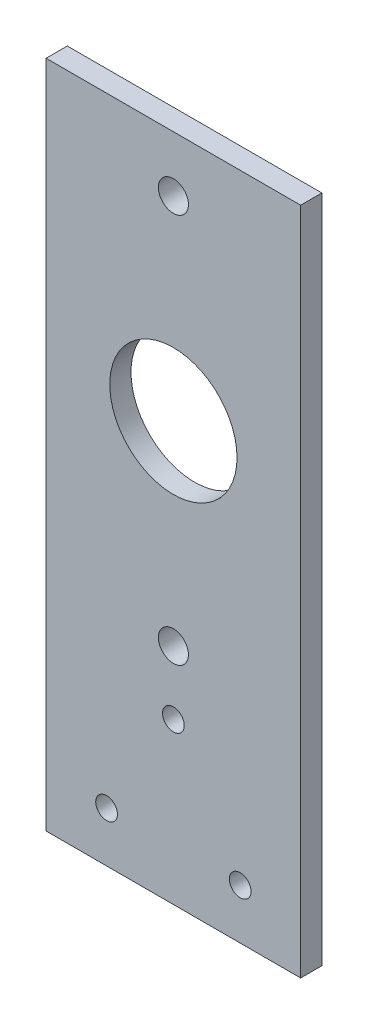
ISO-10303-21;
HEADER;
FILE_DESCRIPTION(('STEP AP214'),'2;1');
FILE_NAME('part.step','',(''),(''),'','','');
FILE_SCHEMA(('AUTOMOTIVE_DESIGN { 1 0 10303 214 1 1 1 1 }'));
ENDSEC;
DATA;
#1=APPLICATION_CONTEXT('core data for automotive mechanical design processes');
#2=APPLICATION_PROTOCOL_DEFINITION('international standard','automotive_design',2000,#1);
#3=PRODUCT_CONTEXT('',#1,'mechanical');
#4=PRODUCT('Part','Part','',(#3));
#5=PRODUCT_RELATED_PRODUCT_CATEGORY('part','',(#4));
#6=PRODUCT_DEFINITION_FORMATION('','',#4);
#7=PRODUCT_DEFINITION_CONTEXT('part definition',#1,'design');
#8=PRODUCT_DEFINITION('design','',#6,#7);
#9=PRODUCT_DEFINITION_SHAPE('','',#8);
#10=(LENGTH_UNIT() NAMED_UNIT(*) SI_UNIT(.MILLI.,.METRE.));
#11=(NAMED_UNIT(*) PLANE_ANGLE_UNIT() SI_UNIT($,.RADIAN.));
#12=(NAMED_UNIT(*) SI_UNIT($,.STERADIAN.) SOLID_ANGLE_UNIT());
#13=UNCERTAINTY_MEASURE_WITH_UNIT(LENGTH_MEASURE(1.E-05),#10,'distance_accuracy_value','');
#14=(GEOMETRIC_REPRESENTATION_CONTEXT(3) GLOBAL_UNCERTAINTY_ASSIGNED_CONTEXT((#13)) GLOBAL_UNIT_ASSIGNED_CONTEXT((#10,
#11,#12)) REPRESENTATION_CONTEXT('',''));
#15=CARTESIAN_POINT('',(0.,0.,0.));
#16=DIRECTION('',(0.,0.,1.));
#17=DIRECTION('',(1.,0.,0.));
#18=AXIS2_PLACEMENT_3D('',#15,#16,#17);
#19=CARTESIAN_POINT('',(0.,0.,6.35));
#20=DIRECTION('',(0.,0.,1.));
#21=DIRECTION('',(1.,0.,0.));
#22=AXIS2_PLACEMENT_3D('',#19,#20,#21);
#23=PLANE('',#22);
#24=CARTESIAN_POINT('',(20.,-110.35,6.35));
#25=DIRECTION('',(0.,0.,1.));
#26=DIRECTION('',(1.,0.,0.));
#27=AXIS2_PLACEMENT_3D('',#24,#25,#26);
#28=CIRCLE('',#27,3.25);
#29=CARTESIAN_POINT('',(23.25,-110.35,6.35));
#30=VERTEX_POINT('',#29);
#31=EDGE_CURVE('E132',#30,#30,#28,.T.);
#32=ORIENTED_EDGE('',*,*,#31,.F.);
#33=EDGE_LOOP('',(#32));
#34=FACE_BOUND('',#33,.T.);
#35=CARTESIAN_POINT('',(0.,-58.34,6.35));
#36=DIRECTION('',(0.,0.,1.));
#37=DIRECTION('',(1.,0.,0.));
#38=AXIS2_PLACEMENT_3D('',#35,#36,#37);
#39=CIRCLE('',#38,4.50000000000001);
#40=CARTESIAN_POINT('',(4.50000000000002,-58.34,6.35));
#41=VERTEX_POINT('',#40);
#42=EDGE_CURVE('E120',#41,#41,#39,.T.);
#43=ORIENTED_EDGE('',*,*,#42,.F.);
#44=EDGE_LOOP('',(#43));
#45=FACE_BOUND('',#44,.T.);
#46=CARTESIAN_POINT('',(0.,0.,6.35));
#47=DIRECTION('',(0.,0.,1.));
#48=DIRECTION('',(1.,0.,0.));
#49=AXIS2_PLACEMENT_3D('',#46,#47,#48);
#50=CIRCLE('',#49,19.05);
#51=CARTESIAN_POINT('',(19.05,0.,6.35));
#52=VERTEX_POINT('',#51);
#53=EDGE_CURVE('E99',#52,#52,#50,.T.);
#54=ORIENTED_EDGE('',*,*,#53,.F.);
#55=EDGE_LOOP('',(#54));
#56=FACE_BOUND('',#55,.T.);
#57=DIRECTION('',(0.,-1.,0.));
#58=VECTOR('',#57,1.);
#59=CARTESIAN_POINT('',(-38.1,75.,6.35));
#60=LINE('',#59,#58);
#61=CARTESIAN_POINT('',(-38.1,75.,6.35));
#62=VERTEX_POINT('',#61);
#63=CARTESIAN_POINT('',(-38.1,-125.35,6.35));
#64=VERTEX_POINT('',#63);
#65=EDGE_CURVE('E84',#62,#64,#60,.T.);
#66=ORIENTED_EDGE('',*,*,#65,.T.);
#67=DIRECTION('',(1.,0.,0.));
#68=VECTOR('',#67,1.);
#69=CARTESIAN_POINT('',(-38.1,-125.35,6.35));
#70=LINE('',#69,#68);
#71=CARTESIAN_POINT('',(38.1,-125.35,6.35));
#72=VERTEX_POINT('',#71);
#73=EDGE_CURVE('E79',#64,#72,#70,.T.);
#74=ORIENTED_EDGE('',*,*,#73,.T.);
#75=DIRECTION('',(0.,1.,0.));
#76=VECTOR('',#75,1.);
#77=CARTESIAN_POINT('',(38.1,75.,6.35));
#78=LINE('',#77,#76);
#79=CARTESIAN_POINT('',(38.1,75.,6.35));
#80=VERTEX_POINT('',#79);
#81=EDGE_CURVE('E82',#72,#80,#78,.T.);
#82=ORIENTED_EDGE('',*,*,#81,.T.);
#83=DIRECTION('',(-1.,0.,0.));
#84=VECTOR('',#83,1.);
#85=CARTESIAN_POINT('',(-38.1,75.,6.35));
#86=LINE('',#85,#84);
#87=EDGE_CURVE('E49',#80,#62,#86,.T.);
#88=ORIENTED_EDGE('',*,*,#87,.T.);
#89=EDGE_LOOP('',(#66,#74,#82,#88));
#90=FACE_BOUND('',#89,.T.);
#91=CARTESIAN_POINT('',(0.,58.34,6.35));
#92=DIRECTION('',(0.,0.,1.));
#93=DIRECTION('',(1.,0.,0.));
#94=AXIS2_PLACEMENT_3D('',#91,#92,#93);
#95=CIRCLE('',#94,4.5);
#96=CARTESIAN_POINT('',(4.49999999999999,58.34,6.35));
#97=VERTEX_POINT('',#96);
#98=EDGE_CURVE('E114',#97,#97,#95,.T.);
#99=ORIENTED_EDGE('',*,*,#98,.F.);
#100=EDGE_LOOP('',(#99));
#101=FACE_BOUND('',#100,.T.);
#102=CARTESIAN_POINT('',(-20.,-110.35,6.35));
#103=DIRECTION('',(0.,0.,1.));
#104=DIRECTION('',(1.,0.,0.));
#105=AXIS2_PLACEMENT_3D('',#102,#103,#104);
#106=CIRCLE('',#105,3.25);
#107=CARTESIAN_POINT('',(-16.75,-110.35,6.35));
#108=VERTEX_POINT('',#107);
#109=EDGE_CURVE('E126',#108,#108,#106,.T.);
#110=ORIENTED_EDGE('',*,*,#109,.F.);
#111=EDGE_LOOP('',(#110));
#112=FACE_BOUND('',#111,.T.);
#113=CARTESIAN_POINT('',(0.,-77.35,6.35));
#114=DIRECTION('',(0.,0.,1.));
#115=DIRECTION('',(1.,0.,0.));
#116=AXIS2_PLACEMENT_3D('',#113,#114,#115);
#117=CIRCLE('',#116,3.25);
#118=CARTESIAN_POINT('',(3.25000000000001,-77.35,6.35));
#119=VERTEX_POINT('',#118);
#120=EDGE_CURVE('E138',#119,#119,#117,.T.);
#121=ORIENTED_EDGE('',*,*,#120,.F.);
#122=EDGE_LOOP('',(#121));
#123=FACE_BOUND('',#122,.T.);
#124=ADVANCED_FACE('F32',(#34,#45,#56,#90,#101,#112,#123),#23,.T.);
#125=CARTESIAN_POINT('',(0.,0.,0.));
#126=DIRECTION('',(0.,0.,1.));
#127=DIRECTION('',(1.,0.,0.));
#128=AXIS2_PLACEMENT_3D('',#125,#126,#127);
#129=PLANE('',#128);
#130=CARTESIAN_POINT('',(20.,-110.35,0.));
#131=DIRECTION('',(0.,0.,1.));
#132=DIRECTION('',(1.,0.,0.));
#133=AXIS2_PLACEMENT_3D('',#130,#131,#132);
#134=CIRCLE('',#133,3.25);
#135=CARTESIAN_POINT('',(23.25,-110.35,0.));
#136=VERTEX_POINT('',#135);
#137=EDGE_CURVE('E135',#136,#136,#134,.T.);
#138=ORIENTED_EDGE('',*,*,#137,.T.);
#139=EDGE_LOOP('',(#138));
#140=FACE_BOUND('',#139,.T.);
#141=CARTESIAN_POINT('',(0.,-58.34,0.));
#142=DIRECTION('',(0.,0.,1.));
#143=DIRECTION('',(1.,0.,0.));
#144=AXIS2_PLACEMENT_3D('',#141,#142,#143);
#145=CIRCLE('',#144,4.50000000000001);
#146=CARTESIAN_POINT('',(4.50000000000002,-58.34,0.));
#147=VERTEX_POINT('',#146);
#148=EDGE_CURVE('E123',#147,#147,#145,.T.);
#149=ORIENTED_EDGE('',*,*,#148,.T.);
#150=EDGE_LOOP('',(#149));
#151=FACE_BOUND('',#150,.T.);
#152=CARTESIAN_POINT('',(0.,0.,0.));
#153=DIRECTION('',(0.,0.,1.));
#154=DIRECTION('',(1.,0.,0.));
#155=AXIS2_PLACEMENT_3D('',#152,#153,#154);
#156=CIRCLE('',#155,19.05);
#157=CARTESIAN_POINT('',(19.05,0.,0.));
#158=VERTEX_POINT('',#157);
#159=EDGE_CURVE('E111',#158,#158,#156,.T.);
#160=ORIENTED_EDGE('',*,*,#159,.T.);
#161=EDGE_LOOP('',(#160));
#162=FACE_BOUND('',#161,.T.);
#163=DIRECTION('',(0.,-1.,0.));
#164=VECTOR('',#163,1.);
#165=CARTESIAN_POINT('',(-38.1,75.,0.));
#166=LINE('',#165,#164);
#167=CARTESIAN_POINT('',(-38.1,75.,0.));
#168=VERTEX_POINT('',#167);
#169=CARTESIAN_POINT('',(-38.1,-125.35,0.));
#170=VERTEX_POINT('',#169);
#171=EDGE_CURVE('E96',#168,#170,#166,.T.);
#172=ORIENTED_EDGE('',*,*,#171,.F.);
#173=DIRECTION('',(-1.,0.,0.));
#174=VECTOR('',#173,1.);
#175=CARTESIAN_POINT('',(-38.1,75.,0.));
#176=LINE('',#175,#174);
#177=CARTESIAN_POINT('',(38.1,75.,0.));
#178=VERTEX_POINT('',#177);
#179=EDGE_CURVE('E72',#178,#168,#176,.T.);
#180=ORIENTED_EDGE('',*,*,#179,.F.);
#181=DIRECTION('',(0.,1.,0.));
#182=VECTOR('',#181,1.);
#183=CARTESIAN_POINT('',(38.1,75.,0.));
#184=LINE('',#183,#182);
#185=CARTESIAN_POINT('',(38.1,-125.35,0.));
#186=VERTEX_POINT('',#185);
#187=EDGE_CURVE('E66',#186,#178,#184,.T.);
#188=ORIENTED_EDGE('',*,*,#187,.F.);
#189=DIRECTION('',(1.,0.,0.));
#190=VECTOR('',#189,1.);
#191=CARTESIAN_POINT('',(-38.1,-125.35,0.));
#192=LINE('',#191,#190);
#193=EDGE_CURVE('E88',#170,#186,#192,.T.);
#194=ORIENTED_EDGE('',*,*,#193,.F.);
#195=EDGE_LOOP('',(#172,#180,#188,#194));
#196=FACE_BOUND('',#195,.T.);
#197=CARTESIAN_POINT('',(0.,58.34,0.));
#198=DIRECTION('',(0.,0.,1.));
#199=DIRECTION('',(1.,0.,0.));
#200=AXIS2_PLACEMENT_3D('',#197,#198,#199);
#201=CIRCLE('',#200,4.5);
#202=CARTESIAN_POINT('',(4.49999999999999,58.34,0.));
#203=VERTEX_POINT('',#202);
#204=EDGE_CURVE('E117',#203,#203,#201,.T.);
#205=ORIENTED_EDGE('',*,*,#204,.T.);
#206=EDGE_LOOP('',(#205));
#207=FACE_BOUND('',#206,.T.);
#208=CARTESIAN_POINT('',(-20.,-110.35,0.));
#209=DIRECTION('',(0.,0.,1.));
#210=DIRECTION('',(1.,0.,0.));
#211=AXIS2_PLACEMENT_3D('',#208,#209,#210);
#212=CIRCLE('',#211,3.25);
#213=CARTESIAN_POINT('',(-16.75,-110.35,0.));
#214=VERTEX_POINT('',#213);
#215=EDGE_CURVE('E129',#214,#214,#212,.T.);
#216=ORIENTED_EDGE('',*,*,#215,.T.);
#217=EDGE_LOOP('',(#216));
#218=FACE_BOUND('',#217,.T.);
#219=CARTESIAN_POINT('',(0.,-77.35,0.));
#220=DIRECTION('',(0.,0.,1.));
#221=DIRECTION('',(1.,0.,0.));
#222=AXIS2_PLACEMENT_3D('',#219,#220,#221);
#223=CIRCLE('',#222,3.25);
#224=CARTESIAN_POINT('',(3.25000000000001,-77.35,0.));
#225=VERTEX_POINT('',#224);
#226=EDGE_CURVE('E141',#225,#225,#223,.T.);
#227=ORIENTED_EDGE('',*,*,#226,.T.);
#228=EDGE_LOOP('',(#227));
#229=FACE_BOUND('',#228,.T.);
#230=ADVANCED_FACE('F107',(#140,#151,#162,#196,#207,#218,#229),#129,.F.);
#231=CARTESIAN_POINT('',(-38.1,75.,6.35));
#232=DIRECTION('',(1.,0.,0.));
#233=DIRECTION('',(0.,1.,0.));
#234=AXIS2_PLACEMENT_3D('',#231,#232,#233);
#235=PLANE('',#234);
#236=ORIENTED_EDGE('',*,*,#171,.T.);
#237=DIRECTION('',(0.,0.,-1.));
#238=VECTOR('',#237,1.);
#239=CARTESIAN_POINT('',(-38.1,-125.35,6.35));
#240=LINE('',#239,#238);
#241=EDGE_CURVE('E11',#64,#170,#240,.T.);
#242=ORIENTED_EDGE('',*,*,#241,.F.);
#243=ORIENTED_EDGE('',*,*,#65,.F.);
#244=DIRECTION('',(0.,0.,-1.));
#245=VECTOR('',#244,1.);
#246=CARTESIAN_POINT('',(-38.1,75.,6.35));
#247=LINE('',#246,#245);
#248=EDGE_CURVE('E92',#62,#168,#247,.T.);
#249=ORIENTED_EDGE('',*,*,#248,.T.);
#250=EDGE_LOOP('',(#236,#242,#243,#249));
#251=FACE_BOUND('',#250,.T.);
#252=ADVANCED_FACE('F34',(#251),#235,.F.);
#253=CARTESIAN_POINT('',(-38.1,-125.35,6.35));
#254=DIRECTION('',(0.,1.,0.));
#255=DIRECTION('',(0.,0.,1.));
#256=AXIS2_PLACEMENT_3D('',#253,#254,#255);
#257=PLANE('',#256);
#258=ORIENTED_EDGE('',*,*,#193,.T.);
#259=DIRECTION('',(0.,0.,-1.));
#260=VECTOR('',#259,1.);
#261=CARTESIAN_POINT('',(38.1,-125.35,6.35));
#262=LINE('',#261,#260);
#263=EDGE_CURVE('E41',#72,#186,#262,.T.);
#264=ORIENTED_EDGE('',*,*,#263,.F.);
#265=ORIENTED_EDGE('',*,*,#73,.F.);
#266=ORIENTED_EDGE('',*,*,#241,.T.);
#267=EDGE_LOOP('',(#258,#264,#265,#266));
#268=FACE_BOUND('',#267,.T.);
#269=ADVANCED_FACE('F87',(#268),#257,.F.);
#270=CARTESIAN_POINT('',(38.1,75.,6.35));
#271=DIRECTION('',(-1.,0.,0.));
#272=DIRECTION('',(0.,-1.,0.));
#273=AXIS2_PLACEMENT_3D('',#270,#271,#272);
#274=PLANE('',#273);
#275=ORIENTED_EDGE('',*,*,#187,.T.);
#276=DIRECTION('',(0.,0.,-1.));
#277=VECTOR('',#276,1.);
#278=CARTESIAN_POINT('',(38.1,75.,6.35));
#279=LINE('',#278,#277);
#280=EDGE_CURVE('E89',#80,#178,#279,.T.);
#281=ORIENTED_EDGE('',*,*,#280,.F.);
#282=ORIENTED_EDGE('',*,*,#81,.F.);
#283=ORIENTED_EDGE('',*,*,#263,.T.);
#284=EDGE_LOOP('',(#275,#281,#282,#283));
#285=FACE_BOUND('',#284,.T.);
#286=ADVANCED_FACE('F90',(#285),#274,.F.);
#287=CARTESIAN_POINT('',(-38.1,75.,6.35));
#288=DIRECTION('',(0.,-1.,0.));
#289=DIRECTION('',(1.,0.,0.));
#290=AXIS2_PLACEMENT_3D('',#287,#288,#289);
#291=PLANE('',#290);
#292=ORIENTED_EDGE('',*,*,#179,.T.);
#293=ORIENTED_EDGE('',*,*,#248,.F.);
#294=ORIENTED_EDGE('',*,*,#87,.F.);
#295=ORIENTED_EDGE('',*,*,#280,.T.);
#296=EDGE_LOOP('',(#292,#293,#294,#295));
#297=FACE_BOUND('',#296,.T.);
#298=ADVANCED_FACE('F104',(#297),#291,.F.);
#299=CARTESIAN_POINT('',(0.,0.,6.35));
#300=DIRECTION('',(0.,0.,-1.));
#301=DIRECTION('',(-1.,0.,0.));
#302=AXIS2_PLACEMENT_3D('',#299,#300,#301);
#303=CYLINDRICAL_SURFACE('',#302,19.05);
#304=ORIENTED_EDGE('',*,*,#53,.T.);
#305=EDGE_LOOP('',(#304));
#306=FACE_BOUND('',#305,.T.);
#307=ORIENTED_EDGE('',*,*,#159,.F.);
#308=EDGE_LOOP('',(#307));
#309=FACE_BOUND('',#308,.T.);
#310=ADVANCED_FACE('F161',(#306,#309),#303,.F.);
#311=CARTESIAN_POINT('',(0.,58.34,6.35));
#312=DIRECTION('',(0.,0.,-1.));
#313=DIRECTION('',(-1.,0.,0.));
#314=AXIS2_PLACEMENT_3D('',#311,#312,#313);
#315=CYLINDRICAL_SURFACE('',#314,4.5);
#316=ORIENTED_EDGE('',*,*,#98,.T.);
#317=EDGE_LOOP('',(#316));
#318=FACE_BOUND('',#317,.T.);
#319=ORIENTED_EDGE('',*,*,#204,.F.);
#320=EDGE_LOOP('',(#319));
#321=FACE_BOUND('',#320,.T.);
#322=ADVANCED_FACE('F207',(#318,#321),#315,.F.);
#323=CARTESIAN_POINT('',(0.,-58.34,6.35));
#324=DIRECTION('',(0.,0.,-1.));
#325=DIRECTION('',(-1.,0.,0.));
#326=AXIS2_PLACEMENT_3D('',#323,#324,#325);
#327=CYLINDRICAL_SURFACE('',#326,4.50000000000001);
#328=ORIENTED_EDGE('',*,*,#42,.T.);
#329=EDGE_LOOP('',(#328));
#330=FACE_BOUND('',#329,.T.);
#331=ORIENTED_EDGE('',*,*,#148,.F.);
#332=EDGE_LOOP('',(#331));
#333=FACE_BOUND('',#332,.T.);
#334=ADVANCED_FACE('F215',(#330,#333),#327,.F.);
#335=CARTESIAN_POINT('',(-20.,-110.35,6.35));
#336=DIRECTION('',(0.,0.,-1.));
#337=DIRECTION('',(-1.,0.,0.));
#338=AXIS2_PLACEMENT_3D('',#335,#336,#337);
#339=CYLINDRICAL_SURFACE('',#338,3.25);
#340=ORIENTED_EDGE('',*,*,#109,.T.);
#341=EDGE_LOOP('',(#340));
#342=FACE_BOUND('',#341,.T.);
#343=ORIENTED_EDGE('',*,*,#215,.F.);
#344=EDGE_LOOP('',(#343));
#345=FACE_BOUND('',#344,.T.);
#346=ADVANCED_FACE('F223',(#342,#345),#339,.F.);
#347=CARTESIAN_POINT('',(20.,-110.35,6.35));
#348=DIRECTION('',(0.,0.,-1.));
#349=DIRECTION('',(-1.,0.,0.));
#350=AXIS2_PLACEMENT_3D('',#347,#348,#349);
#351=CYLINDRICAL_SURFACE('',#350,3.25);
#352=ORIENTED_EDGE('',*,*,#31,.T.);
#353=EDGE_LOOP('',(#352));
#354=FACE_BOUND('',#353,.T.);
#355=ORIENTED_EDGE('',*,*,#137,.F.);
#356=EDGE_LOOP('',(#355));
#357=FACE_BOUND('',#356,.T.);
#358=ADVANCED_FACE('F232',(#354,#357),#351,.F.);
#359=CARTESIAN_POINT('',(0.,-77.35,6.35));
#360=DIRECTION('',(0.,0.,-1.));
#361=DIRECTION('',(-1.,0.,0.));
#362=AXIS2_PLACEMENT_3D('',#359,#360,#361);
#363=CYLINDRICAL_SURFACE('',#362,3.25);
#364=ORIENTED_EDGE('',*,*,#120,.T.);
#365=EDGE_LOOP('',(#364));
#366=FACE_BOUND('',#365,.T.);
#367=ORIENTED_EDGE('',*,*,#226,.F.);
#368=EDGE_LOOP('',(#367));
#369=FACE_BOUND('',#368,.T.);
#370=ADVANCED_FACE('F147',(#366,#369),#363,.F.);
#371=CLOSED_SHELL('',(#124,#230,#252,#269,#286,#298,#310,#322,#334,#346,#358,#370));
#372=MANIFOLD_SOLID_BREP('B2',#371);
#373=ADVANCED_BREP_SHAPE_REPRESENTATION('',(#18,#372),#14);
#374=SHAPE_DEFINITION_REPRESENTATION(#9,#373);
ENDSEC;
END-ISO-10303-21;
